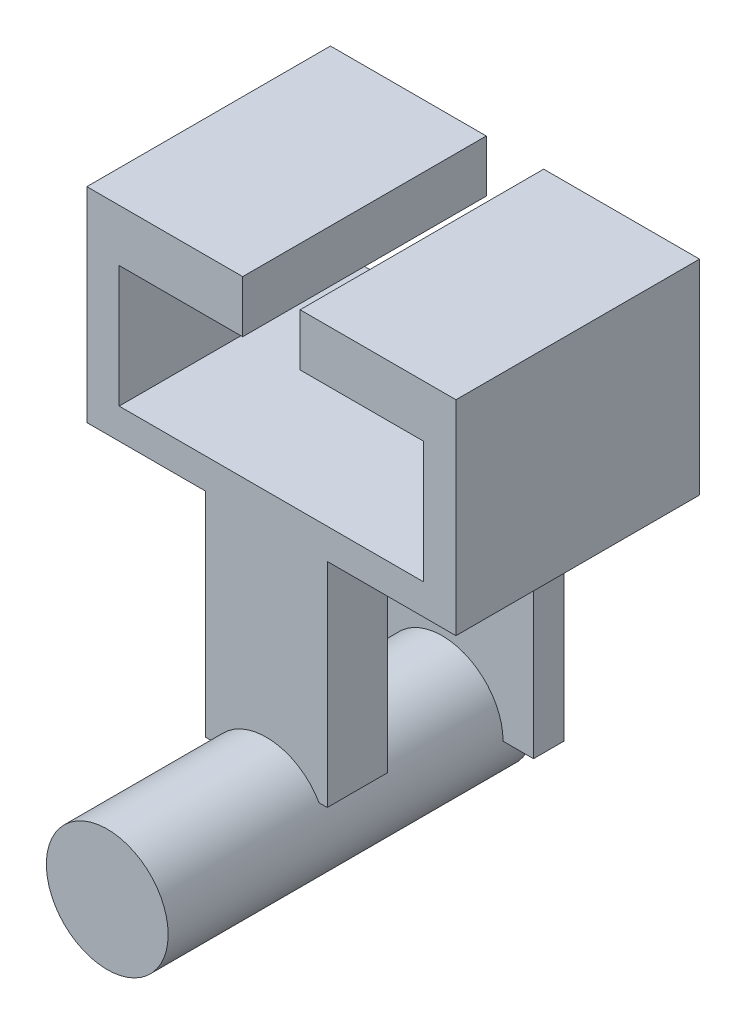
ISO-10303-21;
HEADER;
FILE_DESCRIPTION(('STEP AP214'),'2;1');
FILE_NAME('part.step','',(''),(''),'','','');
FILE_SCHEMA(('AUTOMOTIVE_DESIGN { 1 0 10303 214 1 1 1 1 }'));
ENDSEC;
DATA;
#1=APPLICATION_CONTEXT('core data for automotive mechanical design processes');
#2=APPLICATION_PROTOCOL_DEFINITION('international standard','automotive_design',2000,#1);
#3=PRODUCT_CONTEXT('',#1,'mechanical');
#4=PRODUCT('Part','Part','',(#3));
#5=PRODUCT_RELATED_PRODUCT_CATEGORY('part','',(#4));
#6=PRODUCT_DEFINITION_FORMATION('','',#4);
#7=PRODUCT_DEFINITION_CONTEXT('part definition',#1,'design');
#8=PRODUCT_DEFINITION('design','',#6,#7);
#9=PRODUCT_DEFINITION_SHAPE('','',#8);
#10=(LENGTH_UNIT() NAMED_UNIT(*) SI_UNIT(.MILLI.,.METRE.));
#11=(NAMED_UNIT(*) PLANE_ANGLE_UNIT() SI_UNIT($,.RADIAN.));
#12=(NAMED_UNIT(*) SI_UNIT($,.STERADIAN.) SOLID_ANGLE_UNIT());
#13=UNCERTAINTY_MEASURE_WITH_UNIT(LENGTH_MEASURE(1.E-05),#10,'distance_accuracy_value','');
#14=(GEOMETRIC_REPRESENTATION_CONTEXT(3) GLOBAL_UNCERTAINTY_ASSIGNED_CONTEXT((#13)) GLOBAL_UNIT_ASSIGNED_CONTEXT((#10,
#11,#12)) REPRESENTATION_CONTEXT('',''));
#15=CARTESIAN_POINT('',(0.,0.,0.));
#16=DIRECTION('',(0.,0.,1.));
#17=DIRECTION('',(1.,0.,0.));
#18=AXIS2_PLACEMENT_3D('',#15,#16,#17);
#19=CARTESIAN_POINT('',(0.,0.,76.2));
#20=DIRECTION('',(0.,0.,-1.));
#21=DIRECTION('',(-1.,0.,0.));
#22=AXIS2_PLACEMENT_3D('',#19,#20,#21);
#23=CYLINDRICAL_SURFACE('',#22,12.7);
#24=CARTESIAN_POINT('',(0.,0.,76.2));
#25=DIRECTION('',(0.,0.,1.));
#26=DIRECTION('',(1.,0.,0.));
#27=AXIS2_PLACEMENT_3D('',#24,#25,#26);
#28=CIRCLE('',#27,12.7);
#29=CARTESIAN_POINT('',(12.7,0.,76.2));
#30=VERTEX_POINT('',#29);
#31=EDGE_CURVE('E600',#30,#30,#28,.T.);
#32=ORIENTED_EDGE('',*,*,#31,.F.);
#33=EDGE_LOOP('',(#32));
#34=FACE_BOUND('',#33,.T.);
#35=DIRECTION('',(0.,0.,-1.));
#36=VECTOR('',#35,1.);
#37=CARTESIAN_POINT('',(12.7,0.,76.2));
#38=LINE('',#37,#36);
#39=CARTESIAN_POINT('',(12.7,0.,0.));
#40=VERTEX_POINT('',#39);
#41=CARTESIAN_POINT('',(12.7,0.,6.34999999999999));
#42=VERTEX_POINT('',#41);
#43=EDGE_CURVE('E618',#40,#42,#38,.F.);
#44=ORIENTED_EDGE('',*,*,#43,.T.);
#45=CARTESIAN_POINT('',(0.,0.,6.34999999999999));
#46=DIRECTION('',(0.,0.,-1.));
#47=DIRECTION('',(-1.,0.,0.));
#48=AXIS2_PLACEMENT_3D('',#45,#46,#47);
#49=CIRCLE('',#48,12.7);
#50=CARTESIAN_POINT('',(-12.7,0.,6.34999999999999));
#51=VERTEX_POINT('',#50);
#52=EDGE_CURVE('E605',#51,#42,#49,.T.);
#53=ORIENTED_EDGE('',*,*,#52,.F.);
#54=DIRECTION('',(0.,0.,-1.));
#55=VECTOR('',#54,1.);
#56=CARTESIAN_POINT('',(-12.7,0.,76.2));
#57=LINE('',#56,#55);
#58=CARTESIAN_POINT('',(-12.7,0.,0.));
#59=VERTEX_POINT('',#58);
#60=EDGE_CURVE('E620',#51,#59,#57,.T.);
#61=ORIENTED_EDGE('',*,*,#60,.T.);
#62=CARTESIAN_POINT('',(0.,0.,0.));
#63=DIRECTION('',(0.,0.,1.));
#64=DIRECTION('',(1.,0.,0.));
#65=AXIS2_PLACEMENT_3D('',#62,#63,#64);
#66=CIRCLE('',#65,12.7);
#67=EDGE_CURVE('E602',#59,#40,#66,.T.);
#68=ORIENTED_EDGE('',*,*,#67,.T.);
#69=EDGE_LOOP('',(#44,#53,#61,#68));
#70=FACE_BOUND('',#69,.T.);
#71=DIRECTION('',(0.,0.,-1.));
#72=VECTOR('',#71,1.);
#73=CARTESIAN_POINT('',(10.9985226280624,6.35000000000002,76.2));
#74=LINE('',#73,#72);
#75=CARTESIAN_POINT('',(10.9985226280624,6.35000000000002,43.0134827391879));
#76=VERTEX_POINT('',#75);
#77=CARTESIAN_POINT('',(10.9985226280624,6.35000000000002,30.4131646228967));
#78=VERTEX_POINT('',#77);
#79=EDGE_CURVE('E12',#76,#78,#74,.T.);
#80=ORIENTED_EDGE('',*,*,#79,.F.);
#81=CARTESIAN_POINT('',(0.,0.,43.0134827391879));
#82=DIRECTION('',(0.,0.,1.));
#83=DIRECTION('',(0.,-1.,0.));
#84=AXIS2_PLACEMENT_3D('',#81,#82,#83);
#85=CIRCLE('',#84,12.7);
#86=CARTESIAN_POINT('',(-10.9985226280624,6.35000000000002,43.0134827391879));
#87=VERTEX_POINT('',#86);
#88=EDGE_CURVE('E58',#76,#87,#85,.T.);
#89=ORIENTED_EDGE('',*,*,#88,.T.);
#90=DIRECTION('',(0.,0.,-1.));
#91=VECTOR('',#90,1.);
#92=CARTESIAN_POINT('',(-10.9985226280624,6.35000000000002,76.2));
#93=LINE('',#92,#91);
#94=CARTESIAN_POINT('',(-10.9985226280624,6.35000000000002,30.4131646228967));
#95=VERTEX_POINT('',#94);
#96=EDGE_CURVE('E621',#95,#87,#93,.F.);
#97=ORIENTED_EDGE('',*,*,#96,.F.);
#98=CARTESIAN_POINT('',(0.,0.,30.4131646228967));
#99=DIRECTION('',(0.,0.,1.));
#100=DIRECTION('',(0.,-1.,0.));
#101=AXIS2_PLACEMENT_3D('',#98,#99,#100);
#102=CIRCLE('',#101,12.7);
#103=EDGE_CURVE('E68',#78,#95,#102,.T.);
#104=ORIENTED_EDGE('',*,*,#103,.F.);
#105=EDGE_LOOP('',(#80,#89,#97,#104));
#106=FACE_BOUND('',#105,.T.);
#107=ADVANCED_FACE('F51',(#34,#70,#106),#23,.T.);
#108=CARTESIAN_POINT('',(32.7980582503673,82.55,-7.78651726081213));
#109=DIRECTION('',(1.,0.,0.));
#110=DIRECTION('',(0.,1.,0.));
#111=AXIS2_PLACEMENT_3D('',#108,#109,#110);
#112=PLANE('',#111);
#113=DIRECTION('',(0.,0.,1.));
#114=VECTOR('',#113,1.);
#115=CARTESIAN_POINT('',(32.7980582503673,82.55,-7.78651726081213));
#116=LINE('',#115,#114);
#117=CARTESIAN_POINT('',(32.7980582503673,82.55,-7.78651726081213));
#118=VERTEX_POINT('',#117);
#119=CARTESIAN_POINT('',(32.7980582503673,82.55,43.0134827391879));
#120=VERTEX_POINT('',#119);
#121=EDGE_CURVE('E433',#118,#120,#116,.T.);
#122=ORIENTED_EDGE('',*,*,#121,.F.);
#123=DIRECTION('',(0.,-1.,0.));
#124=VECTOR('',#123,1.);
#125=CARTESIAN_POINT('',(32.7980582503673,82.55,-7.78651726081213));
#126=LINE('',#125,#124);
#127=CARTESIAN_POINT('',(32.7980582503673,57.15,-7.78651726081213));
#128=VERTEX_POINT('',#127);
#129=EDGE_CURVE('E528',#118,#128,#126,.T.);
#130=ORIENTED_EDGE('',*,*,#129,.T.);
#131=DIRECTION('',(0.,0.,1.));
#132=VECTOR('',#131,1.);
#133=CARTESIAN_POINT('',(32.7980582503673,57.15,-7.78651726081213));
#134=LINE('',#133,#132);
#135=CARTESIAN_POINT('',(32.7980582503673,57.15,43.0134827391879));
#136=VERTEX_POINT('',#135);
#137=EDGE_CURVE('E697',#128,#136,#134,.T.);
#138=ORIENTED_EDGE('',*,*,#137,.T.);
#139=DIRECTION('',(0.,-1.,0.));
#140=VECTOR('',#139,1.);
#141=CARTESIAN_POINT('',(32.7980582503673,82.55,43.0134827391879));
#142=LINE('',#141,#140);
#143=EDGE_CURVE('E525',#120,#136,#142,.T.);
#144=ORIENTED_EDGE('',*,*,#143,.F.);
#145=EDGE_LOOP('',(#122,#130,#138,#144));
#146=FACE_BOUND('',#145,.T.);
#147=ADVANCED_FACE('F800',(#146),#112,.F.);
#148=CARTESIAN_POINT('',(-30.7019417496327,82.55,-7.78651726081213));
#149=DIRECTION('',(-1.,0.,0.));
#150=DIRECTION('',(0.,-1.,0.));
#151=AXIS2_PLACEMENT_3D('',#148,#149,#150);
#152=PLANE('',#151);
#153=DIRECTION('',(0.,0.,-1.));
#154=VECTOR('',#153,1.);
#155=CARTESIAN_POINT('',(-30.7019417496326,82.55,43.0134827391879));
#156=LINE('',#155,#154);
#157=CARTESIAN_POINT('',(-30.7019417496326,82.55,43.0134827391879));
#158=VERTEX_POINT('',#157);
#159=CARTESIAN_POINT('',(-30.7019417496327,82.55,-7.78651726081213));
#160=VERTEX_POINT('',#159);
#161=EDGE_CURVE('E475',#158,#160,#156,.T.);
#162=ORIENTED_EDGE('',*,*,#161,.F.);
#163=DIRECTION('',(0.,-1.,0.));
#164=VECTOR('',#163,1.);
#165=CARTESIAN_POINT('',(-30.7019417496326,82.55,43.0134827391879));
#166=LINE('',#165,#164);
#167=CARTESIAN_POINT('',(-30.7019417496326,57.15,43.0134827391879));
#168=VERTEX_POINT('',#167);
#169=EDGE_CURVE('E514',#158,#168,#166,.T.);
#170=ORIENTED_EDGE('',*,*,#169,.T.);
#171=DIRECTION('',(0.,0.,-1.));
#172=VECTOR('',#171,1.);
#173=CARTESIAN_POINT('',(-30.7019417496327,57.15,-7.78651726081213));
#174=LINE('',#173,#172);
#175=CARTESIAN_POINT('',(-30.7019417496327,57.15,-7.78651726081213));
#176=VERTEX_POINT('',#175);
#177=EDGE_CURVE('E503',#168,#176,#174,.T.);
#178=ORIENTED_EDGE('',*,*,#177,.T.);
#179=DIRECTION('',(0.,-1.,0.));
#180=VECTOR('',#179,1.);
#181=CARTESIAN_POINT('',(-30.7019417496327,82.55,-7.78651726081213));
#182=LINE('',#181,#180);
#183=EDGE_CURVE('E507',#160,#176,#182,.T.);
#184=ORIENTED_EDGE('',*,*,#183,.F.);
#185=EDGE_LOOP('',(#162,#170,#178,#184));
#186=FACE_BOUND('',#185,.T.);
#187=ADVANCED_FACE('F804',(#186),#152,.F.);
#188=CARTESIAN_POINT('',(0.,0.,76.2));
#189=DIRECTION('',(0.,0.,1.));
#190=DIRECTION('',(1.,0.,0.));
#191=AXIS2_PLACEMENT_3D('',#188,#189,#190);
#192=PLANE('',#191);
#193=ORIENTED_EDGE('',*,*,#31,.T.);
#194=EDGE_LOOP('',(#193));
#195=FACE_BOUND('',#194,.T.);
#196=ADVANCED_FACE('F807',(#195),#192,.T.);
#197=CARTESIAN_POINT('',(0.,0.,0.));
#198=DIRECTION('',(0.,0.,1.));
#199=DIRECTION('',(1.,0.,0.));
#200=AXIS2_PLACEMENT_3D('',#197,#198,#199);
#201=PLANE('',#200);
#202=DIRECTION('',(0.,1.,0.));
#203=VECTOR('',#202,1.);
#204=CARTESIAN_POINT('',(12.7,0.,0.));
#205=LINE('',#204,#203);
#206=CARTESIAN_POINT('',(12.7,25.4,0.));
#207=VERTEX_POINT('',#206);
#208=CARTESIAN_POINT('',(12.7,50.8,0.));
#209=VERTEX_POINT('',#208);
#210=EDGE_CURVE('E388',#207,#209,#205,.T.);
#211=ORIENTED_EDGE('',*,*,#210,.T.);
#212=DIRECTION('',(1.,0.,0.));
#213=VECTOR('',#212,1.);
#214=CARTESIAN_POINT('',(-19.05,50.8,0.));
#215=LINE('',#214,#213);
#216=CARTESIAN_POINT('',(19.05,50.8,0.));
#217=VERTEX_POINT('',#216);
#218=EDGE_CURVE('E548',#209,#217,#215,.T.);
#219=ORIENTED_EDGE('',*,*,#218,.T.);
#220=DIRECTION('',(0.,-1.,0.));
#221=VECTOR('',#220,1.);
#222=CARTESIAN_POINT('',(19.05,50.8,0.));
#223=LINE('',#222,#221);
#224=CARTESIAN_POINT('',(19.05,0.,0.));
#225=VERTEX_POINT('',#224);
#226=EDGE_CURVE('E547',#217,#225,#223,.T.);
#227=ORIENTED_EDGE('',*,*,#226,.T.);
#228=DIRECTION('',(-1.,0.,0.));
#229=VECTOR('',#228,1.);
#230=CARTESIAN_POINT('',(0.,0.,0.));
#231=LINE('',#230,#229);
#232=EDGE_CURVE('E559',#225,#40,#231,.T.);
#233=ORIENTED_EDGE('',*,*,#232,.T.);
#234=ORIENTED_EDGE('',*,*,#67,.F.);
#235=CARTESIAN_POINT('',(-19.05,0.,0.));
#236=VERTEX_POINT('',#235);
#237=EDGE_CURVE('E556',#59,#236,#231,.T.);
#238=ORIENTED_EDGE('',*,*,#237,.T.);
#239=DIRECTION('',(0.,1.,0.));
#240=VECTOR('',#239,1.);
#241=CARTESIAN_POINT('',(-19.05,0.,0.));
#242=LINE('',#241,#240);
#243=CARTESIAN_POINT('',(-19.05,50.8,0.));
#244=VERTEX_POINT('',#243);
#245=EDGE_CURVE('E715',#236,#244,#242,.T.);
#246=ORIENTED_EDGE('',*,*,#245,.T.);
#247=CARTESIAN_POINT('',(-12.7,50.8,0.));
#248=VERTEX_POINT('',#247);
#249=EDGE_CURVE('E545',#244,#248,#215,.T.);
#250=ORIENTED_EDGE('',*,*,#249,.T.);
#251=DIRECTION('',(0.,1.,0.));
#252=VECTOR('',#251,1.);
#253=CARTESIAN_POINT('',(-12.7,0.,0.));
#254=LINE('',#253,#252);
#255=CARTESIAN_POINT('',(-12.7,25.4,0.));
#256=VERTEX_POINT('',#255);
#257=EDGE_CURVE('E385',#256,#248,#254,.T.);
#258=ORIENTED_EDGE('',*,*,#257,.F.);
#259=DIRECTION('',(1.,0.,0.));
#260=VECTOR('',#259,1.);
#261=CARTESIAN_POINT('',(0.,25.4,0.));
#262=LINE('',#261,#260);
#263=EDGE_CURVE('E394',#256,#207,#262,.T.);
#264=ORIENTED_EDGE('',*,*,#263,.T.);
#265=EDGE_LOOP('',(#211,#219,#227,#233,#234,#238,#246,#250,#258,#264));
#266=FACE_BOUND('',#265,.T.);
#267=ADVANCED_FACE('F739',(#266),#201,.F.);
#268=CARTESIAN_POINT('',(0.,0.,6.35));
#269=DIRECTION('',(0.,-1.,0.));
#270=DIRECTION('',(0.,0.,-1.));
#271=AXIS2_PLACEMENT_3D('',#268,#269,#270);
#272=PLANE('',#271);
#273=ORIENTED_EDGE('',*,*,#60,.F.);
#274=DIRECTION('',(-1.,0.,0.));
#275=VECTOR('',#274,1.);
#276=CARTESIAN_POINT('',(19.05,0.,6.35));
#277=LINE('',#276,#275);
#278=CARTESIAN_POINT('',(-19.05,0.,6.35));
#279=VERTEX_POINT('',#278);
#280=EDGE_CURVE('E576',#51,#279,#277,.T.);
#281=ORIENTED_EDGE('',*,*,#280,.T.);
#282=DIRECTION('',(0.,0.,-1.));
#283=VECTOR('',#282,1.);
#284=CARTESIAN_POINT('',(-19.05,0.,6.35));
#285=LINE('',#284,#283);
#286=EDGE_CURVE('E722',#279,#236,#285,.T.);
#287=ORIENTED_EDGE('',*,*,#286,.T.);
#288=ORIENTED_EDGE('',*,*,#237,.F.);
#289=EDGE_LOOP('',(#273,#281,#287,#288));
#290=FACE_BOUND('',#289,.T.);
#291=ADVANCED_FACE('F815',(#290),#272,.T.);
#292=ORIENTED_EDGE('',*,*,#43,.F.);
#293=ORIENTED_EDGE('',*,*,#232,.F.);
#294=DIRECTION('',(0.,0.,-1.));
#295=VECTOR('',#294,1.);
#296=CARTESIAN_POINT('',(19.05,0.,6.35));
#297=LINE('',#296,#295);
#298=CARTESIAN_POINT('',(19.05,0.,6.35));
#299=VERTEX_POINT('',#298);
#300=EDGE_CURVE('E593',#299,#225,#297,.T.);
#301=ORIENTED_EDGE('',*,*,#300,.F.);
#302=EDGE_CURVE('E578',#299,#42,#277,.T.);
#303=ORIENTED_EDGE('',*,*,#302,.T.);
#304=EDGE_LOOP('',(#292,#293,#301,#303));
#305=FACE_BOUND('',#304,.T.);
#306=ADVANCED_FACE('F737',(#305),#272,.T.);
#307=CARTESIAN_POINT('',(-19.05,0.,6.35));
#308=DIRECTION('',(-1.,0.,0.));
#309=DIRECTION('',(0.,0.,1.));
#310=AXIS2_PLACEMENT_3D('',#307,#308,#309);
#311=PLANE('',#310);
#312=ORIENTED_EDGE('',*,*,#245,.F.);
#313=ORIENTED_EDGE('',*,*,#286,.F.);
#314=DIRECTION('',(0.,1.,0.));
#315=VECTOR('',#314,1.);
#316=CARTESIAN_POINT('',(-19.05,0.,6.35));
#317=LINE('',#316,#315);
#318=CARTESIAN_POINT('',(-19.05,50.8,6.35));
#319=VERTEX_POINT('',#318);
#320=EDGE_CURVE('E549',#279,#319,#317,.T.);
#321=ORIENTED_EDGE('',*,*,#320,.T.);
#322=DIRECTION('',(0.,0.,-1.));
#323=VECTOR('',#322,1.);
#324=CARTESIAN_POINT('',(-19.05,50.8,6.35));
#325=LINE('',#324,#323);
#326=EDGE_CURVE('E727',#319,#244,#325,.T.);
#327=ORIENTED_EDGE('',*,*,#326,.T.);
#328=EDGE_LOOP('',(#312,#313,#321,#327));
#329=FACE_BOUND('',#328,.T.);
#330=ADVANCED_FACE('F776',(#329),#311,.T.);
#331=CARTESIAN_POINT('',(19.05,50.8,6.35));
#332=DIRECTION('',(1.,0.,0.));
#333=DIRECTION('',(0.,1.,0.));
#334=AXIS2_PLACEMENT_3D('',#331,#332,#333);
#335=PLANE('',#334);
#336=ORIENTED_EDGE('',*,*,#226,.F.);
#337=DIRECTION('',(0.,0.,-1.));
#338=VECTOR('',#337,1.);
#339=CARTESIAN_POINT('',(19.05,50.8,6.35));
#340=LINE('',#339,#338);
#341=CARTESIAN_POINT('',(19.05,50.8,6.35));
#342=VERTEX_POINT('',#341);
#343=EDGE_CURVE('E588',#342,#217,#340,.T.);
#344=ORIENTED_EDGE('',*,*,#343,.F.);
#345=DIRECTION('',(0.,-1.,0.));
#346=VECTOR('',#345,1.);
#347=CARTESIAN_POINT('',(19.05,50.8,6.35));
#348=LINE('',#347,#346);
#349=EDGE_CURVE('E575',#342,#299,#348,.T.);
#350=ORIENTED_EDGE('',*,*,#349,.T.);
#351=ORIENTED_EDGE('',*,*,#300,.T.);
#352=EDGE_LOOP('',(#336,#344,#350,#351));
#353=FACE_BOUND('',#352,.T.);
#354=ADVANCED_FACE('F742',(#353),#335,.T.);
#355=CARTESIAN_POINT('',(0.,0.,6.35));
#356=DIRECTION('',(0.,0.,-1.));
#357=DIRECTION('',(-1.,0.,0.));
#358=AXIS2_PLACEMENT_3D('',#355,#356,#357);
#359=PLANE('',#358);
#360=ORIENTED_EDGE('',*,*,#52,.T.);
#361=ORIENTED_EDGE('',*,*,#302,.F.);
#362=ORIENTED_EDGE('',*,*,#349,.F.);
#363=DIRECTION('',(1.,0.,0.));
#364=VECTOR('',#363,1.);
#365=CARTESIAN_POINT('',(-19.05,50.8,6.35));
#366=LINE('',#365,#364);
#367=CARTESIAN_POINT('',(12.7,50.8,6.35));
#368=VERTEX_POINT('',#367);
#369=EDGE_CURVE('E572',#368,#342,#366,.T.);
#370=ORIENTED_EDGE('',*,*,#369,.F.);
#371=DIRECTION('',(0.,-1.,0.));
#372=VECTOR('',#371,1.);
#373=CARTESIAN_POINT('',(12.7,0.,6.35));
#374=LINE('',#373,#372);
#375=CARTESIAN_POINT('',(12.7,25.4,6.35));
#376=VERTEX_POINT('',#375);
#377=EDGE_CURVE('E416',#368,#376,#374,.T.);
#378=ORIENTED_EDGE('',*,*,#377,.T.);
#379=DIRECTION('',(1.,0.,0.));
#380=VECTOR('',#379,1.);
#381=CARTESIAN_POINT('',(0.,25.4,6.35));
#382=LINE('',#381,#380);
#383=CARTESIAN_POINT('',(-12.7,25.4,6.35));
#384=VERTEX_POINT('',#383);
#385=EDGE_CURVE('E408',#376,#384,#382,.F.);
#386=ORIENTED_EDGE('',*,*,#385,.T.);
#387=DIRECTION('',(0.,-1.,0.));
#388=VECTOR('',#387,1.);
#389=CARTESIAN_POINT('',(-12.7,0.,6.35));
#390=LINE('',#389,#388);
#391=CARTESIAN_POINT('',(-12.7,50.8,6.35));
#392=VERTEX_POINT('',#391);
#393=EDGE_CURVE('E426',#392,#384,#390,.T.);
#394=ORIENTED_EDGE('',*,*,#393,.F.);
#395=EDGE_CURVE('E568',#319,#392,#366,.T.);
#396=ORIENTED_EDGE('',*,*,#395,.F.);
#397=ORIENTED_EDGE('',*,*,#320,.F.);
#398=ORIENTED_EDGE('',*,*,#280,.F.);
#399=EDGE_LOOP('',(#360,#361,#362,#370,#378,#386,#394,#396,#397,#398));
#400=FACE_BOUND('',#399,.T.);
#401=ADVANCED_FACE('F749',(#400),#359,.F.);
#402=CARTESIAN_POINT('',(-30.7019417496327,57.15,43.0134827391879));
#403=DIRECTION('',(0.,0.,-1.));
#404=DIRECTION('',(-1.,0.,0.));
#405=AXIS2_PLACEMENT_3D('',#402,#403,#404);
#406=PLANE('',#405);
#407=DIRECTION('',(1.,0.,0.));
#408=VECTOR('',#407,1.);
#409=CARTESIAN_POINT('',(-30.7019417496327,50.8,43.0134827391879));
#410=LINE('',#409,#408);
#411=CARTESIAN_POINT('',(12.7,50.8,43.0134827391879));
#412=VERTEX_POINT('',#411);
#413=CARTESIAN_POINT('',(39.5366782503673,50.8,43.0134827391879));
#414=VERTEX_POINT('',#413);
#415=EDGE_CURVE('E527',#412,#414,#410,.T.);
#416=ORIENTED_EDGE('',*,*,#415,.T.);
#417=DIRECTION('',(0.,-1.,0.));
#418=VECTOR('',#417,1.);
#419=CARTESIAN_POINT('',(39.5366782503673,93.4212,43.0134827391879));
#420=LINE('',#419,#418);
#421=CARTESIAN_POINT('',(39.5366782503673,93.4212,43.0134827391879));
#422=VERTEX_POINT('',#421);
#423=EDGE_CURVE('E288',#422,#414,#420,.T.);
#424=ORIENTED_EDGE('',*,*,#423,.F.);
#425=DIRECTION('',(1.,0.,0.));
#426=VECTOR('',#425,1.);
#427=CARTESIAN_POINT('',(32.7980582503673,93.4212,43.0134827391879));
#428=LINE('',#427,#426);
#429=CARTESIAN_POINT('',(7.03483825036735,93.4212,43.0134827391879));
#430=VERTEX_POINT('',#429);
#431=EDGE_CURVE('E465',#430,#422,#428,.T.);
#432=ORIENTED_EDGE('',*,*,#431,.F.);
#433=DIRECTION('',(0.,1.,0.));
#434=VECTOR('',#433,1.);
#435=CARTESIAN_POINT('',(7.03483825036735,93.4212,43.0134827391879));
#436=LINE('',#435,#434);
#437=CARTESIAN_POINT('',(7.03483825036735,82.55,43.0134827391879));
#438=VERTEX_POINT('',#437);
#439=EDGE_CURVE('E445',#438,#430,#436,.T.);
#440=ORIENTED_EDGE('',*,*,#439,.F.);
#441=DIRECTION('',(1.,0.,0.));
#442=VECTOR('',#441,1.);
#443=CARTESIAN_POINT('',(7.03483825036735,82.55,43.0134827391879));
#444=LINE('',#443,#442);
#445=EDGE_CURVE('E452',#438,#120,#444,.T.);
#446=ORIENTED_EDGE('',*,*,#445,.T.);
#447=ORIENTED_EDGE('',*,*,#143,.T.);
#448=DIRECTION('',(1.,0.,0.));
#449=VECTOR('',#448,1.);
#450=CARTESIAN_POINT('',(-30.7019417496327,57.15,43.0134827391879));
#451=LINE('',#450,#449);
#452=EDGE_CURVE('E529',#168,#136,#451,.T.);
#453=ORIENTED_EDGE('',*,*,#452,.F.);
#454=ORIENTED_EDGE('',*,*,#169,.F.);
#455=DIRECTION('',(-1.,0.,0.));
#456=VECTOR('',#455,1.);
#457=CARTESIAN_POINT('',(-4.93872174963264,82.55,43.0134827391879));
#458=LINE('',#457,#456);
#459=CARTESIAN_POINT('',(-4.93872174963264,82.55,43.0134827391879));
#460=VERTEX_POINT('',#459);
#461=EDGE_CURVE('E488',#460,#158,#458,.T.);
#462=ORIENTED_EDGE('',*,*,#461,.F.);
#463=DIRECTION('',(0.,-1.,0.));
#464=VECTOR('',#463,1.);
#465=CARTESIAN_POINT('',(-4.93872174963264,93.4212,43.0134827391879));
#466=LINE('',#465,#464);
#467=CARTESIAN_POINT('',(-4.93872174963264,93.4212,43.0134827391879));
#468=VERTEX_POINT('',#467);
#469=EDGE_CURVE('E479',#468,#460,#466,.T.);
#470=ORIENTED_EDGE('',*,*,#469,.F.);
#471=DIRECTION('',(1.,0.,0.));
#472=VECTOR('',#471,1.);
#473=CARTESIAN_POINT('',(-31.0905617496326,93.4212,43.0134827391879));
#474=LINE('',#473,#472);
#475=CARTESIAN_POINT('',(-37.4405617496326,93.4212,43.0134827391879));
#476=VERTEX_POINT('',#475);
#477=EDGE_CURVE('E500',#476,#468,#474,.T.);
#478=ORIENTED_EDGE('',*,*,#477,.F.);
#479=DIRECTION('',(0.,1.,0.));
#480=VECTOR('',#479,1.);
#481=CARTESIAN_POINT('',(-37.4405617496326,93.4212,43.0134827391879));
#482=LINE('',#481,#480);
#483=CARTESIAN_POINT('',(-37.4405617496326,50.8,43.0134827391879));
#484=VERTEX_POINT('',#483);
#485=EDGE_CURVE('E270',#484,#476,#482,.T.);
#486=ORIENTED_EDGE('',*,*,#485,.F.);
#487=CARTESIAN_POINT('',(-12.7,50.8,43.0134827391879));
#488=VERTEX_POINT('',#487);
#489=EDGE_CURVE('E256',#484,#488,#410,.T.);
#490=ORIENTED_EDGE('',*,*,#489,.T.);
#491=DIRECTION('',(0.,1.,0.));
#492=VECTOR('',#491,1.);
#493=CARTESIAN_POINT('',(-12.7,6.35000000000002,43.0134827391879));
#494=LINE('',#493,#492);
#495=CARTESIAN_POINT('',(-12.7,6.35000000000002,43.0134827391879));
#496=VERTEX_POINT('',#495);
#497=EDGE_CURVE('E328',#496,#488,#494,.T.);
#498=ORIENTED_EDGE('',*,*,#497,.F.);
#499=DIRECTION('',(1.,0.,0.));
#500=VECTOR('',#499,1.);
#501=CARTESIAN_POINT('',(-12.7,6.35000000000002,43.0134827391879));
#502=LINE('',#501,#500);
#503=EDGE_CURVE('E337',#496,#87,#502,.T.);
#504=ORIENTED_EDGE('',*,*,#503,.T.);
#505=ORIENTED_EDGE('',*,*,#88,.F.);
#506=CARTESIAN_POINT('',(12.7,6.35000000000002,43.0134827391879));
#507=VERTEX_POINT('',#506);
#508=EDGE_CURVE('E326',#76,#507,#502,.T.);
#509=ORIENTED_EDGE('',*,*,#508,.T.);
#510=DIRECTION('',(0.,1.,0.));
#511=VECTOR('',#510,1.);
#512=CARTESIAN_POINT('',(12.7,6.35000000000002,43.0134827391879));
#513=LINE('',#512,#511);
#514=EDGE_CURVE('E357',#507,#412,#513,.T.);
#515=ORIENTED_EDGE('',*,*,#514,.T.);
#516=EDGE_LOOP('',(#416,#424,#432,#440,#446,#447,#453,#454,#462,#470,#478,#486,#490,#498,#504,
#505,#509,#515));
#517=FACE_BOUND('',#516,.T.);
#518=ADVANCED_FACE('F634',(#517),#406,.F.);
#519=CARTESIAN_POINT('',(-30.7019417496327,57.15,-7.78651726081213));
#520=DIRECTION('',(0.,0.,1.));
#521=DIRECTION('',(1.,0.,0.));
#522=AXIS2_PLACEMENT_3D('',#519,#520,#521);
#523=PLANE('',#522);
#524=DIRECTION('',(-1.,0.,0.));
#525=VECTOR('',#524,1.);
#526=CARTESIAN_POINT('',(-4.93872174963265,82.55,-7.78651726081213));
#527=LINE('',#526,#525);
#528=CARTESIAN_POINT('',(-4.93872174963265,82.55,-7.78651726081213));
#529=VERTEX_POINT('',#528);
#530=EDGE_CURVE('E485',#529,#160,#527,.T.);
#531=ORIENTED_EDGE('',*,*,#530,.T.);
#532=ORIENTED_EDGE('',*,*,#183,.T.);
#533=DIRECTION('',(-1.,0.,0.));
#534=VECTOR('',#533,1.);
#535=CARTESIAN_POINT('',(-30.7019417496327,57.15,-7.78651726081213));
#536=LINE('',#535,#534);
#537=EDGE_CURVE('E534',#128,#176,#536,.T.);
#538=ORIENTED_EDGE('',*,*,#537,.F.);
#539=ORIENTED_EDGE('',*,*,#129,.F.);
#540=DIRECTION('',(1.,0.,0.));
#541=VECTOR('',#540,1.);
#542=CARTESIAN_POINT('',(7.03483825036735,82.55,-7.78651726081213));
#543=LINE('',#542,#541);
#544=CARTESIAN_POINT('',(7.03483825036735,82.55,-7.78651726081213));
#545=VERTEX_POINT('',#544);
#546=EDGE_CURVE('E457',#545,#118,#543,.T.);
#547=ORIENTED_EDGE('',*,*,#546,.F.);
#548=DIRECTION('',(0.,-1.,0.));
#549=VECTOR('',#548,1.);
#550=CARTESIAN_POINT('',(7.03483825036735,93.4212,-7.78651726081213));
#551=LINE('',#550,#549);
#552=CARTESIAN_POINT('',(7.03483825036735,93.4212,-7.78651726081213));
#553=VERTEX_POINT('',#552);
#554=EDGE_CURVE('E432',#553,#545,#551,.T.);
#555=ORIENTED_EDGE('',*,*,#554,.F.);
#556=DIRECTION('',(-1.,0.,0.));
#557=VECTOR('',#556,1.);
#558=CARTESIAN_POINT('',(32.7980582503673,93.4212,-7.78651726081213));
#559=LINE('',#558,#557);
#560=CARTESIAN_POINT('',(39.5366782503673,93.4212,-7.78651726081213));
#561=VERTEX_POINT('',#560);
#562=EDGE_CURVE('E467',#561,#553,#559,.T.);
#563=ORIENTED_EDGE('',*,*,#562,.F.);
#564=DIRECTION('',(0.,1.,0.));
#565=VECTOR('',#564,1.);
#566=CARTESIAN_POINT('',(39.5366782503673,93.4212,-7.78651726081213));
#567=LINE('',#566,#565);
#568=CARTESIAN_POINT('',(39.5366782503673,50.8,-7.78651726081213));
#569=VERTEX_POINT('',#568);
#570=EDGE_CURVE('E296',#569,#561,#567,.T.);
#571=ORIENTED_EDGE('',*,*,#570,.F.);
#572=DIRECTION('',(-1.,0.,0.));
#573=VECTOR('',#572,1.);
#574=CARTESIAN_POINT('',(-30.7019417496327,50.8,-7.78651726081213));
#575=LINE('',#574,#573);
#576=CARTESIAN_POINT('',(12.7,50.8,-7.78651726081213));
#577=VERTEX_POINT('',#576);
#578=EDGE_CURVE('E257',#569,#577,#575,.T.);
#579=ORIENTED_EDGE('',*,*,#578,.T.);
#580=CARTESIAN_POINT('',(-12.7,50.8,-7.78651726081213));
#581=VERTEX_POINT('',#580);
#582=EDGE_CURVE('E255',#577,#581,#575,.T.);
#583=ORIENTED_EDGE('',*,*,#582,.T.);
#584=CARTESIAN_POINT('',(-37.4405617496327,50.8,-7.78651726081213));
#585=VERTEX_POINT('',#584);
#586=EDGE_CURVE('E244',#581,#585,#575,.T.);
#587=ORIENTED_EDGE('',*,*,#586,.T.);
#588=DIRECTION('',(0.,-1.,0.));
#589=VECTOR('',#588,1.);
#590=CARTESIAN_POINT('',(-37.4405617496327,93.4212,-7.78651726081213));
#591=LINE('',#590,#589);
#592=CARTESIAN_POINT('',(-37.4405617496327,93.4212,-7.78651726081213));
#593=VERTEX_POINT('',#592);
#594=EDGE_CURVE('E248',#593,#585,#591,.T.);
#595=ORIENTED_EDGE('',*,*,#594,.F.);
#596=DIRECTION('',(-1.,0.,0.));
#597=VECTOR('',#596,1.);
#598=CARTESIAN_POINT('',(-31.0905617496326,93.4212,-7.78651726081213));
#599=LINE('',#598,#597);
#600=CARTESIAN_POINT('',(-4.93872174963265,93.4212,-7.78651726081213));
#601=VERTEX_POINT('',#600);
#602=EDGE_CURVE('E501',#601,#593,#599,.T.);
#603=ORIENTED_EDGE('',*,*,#602,.F.);
#604=DIRECTION('',(0.,1.,0.));
#605=VECTOR('',#604,1.);
#606=CARTESIAN_POINT('',(-4.93872174963265,93.4212,-7.78651726081213));
#607=LINE('',#606,#605);
#608=EDGE_CURVE('E674',#529,#601,#607,.T.);
#609=ORIENTED_EDGE('',*,*,#608,.F.);
#610=EDGE_LOOP('',(#531,#532,#538,#539,#547,#555,#563,#571,#579,#583,#587,#595,#603,#609));
#611=FACE_BOUND('',#610,.T.);
#612=ADVANCED_FACE('F250',(#611),#523,.F.);
#613=CARTESIAN_POINT('',(0.,57.15,0.));
#614=DIRECTION('',(0.,1.,0.));
#615=DIRECTION('',(-1.,0.,0.));
#616=AXIS2_PLACEMENT_3D('',#613,#614,#615);
#617=PLANE('',#616);
#618=ORIENTED_EDGE('',*,*,#537,.T.);
#619=ORIENTED_EDGE('',*,*,#177,.F.);
#620=ORIENTED_EDGE('',*,*,#452,.T.);
#621=ORIENTED_EDGE('',*,*,#137,.F.);
#622=EDGE_LOOP('',(#618,#619,#620,#621));
#623=FACE_BOUND('',#622,.T.);
#624=ADVANCED_FACE('F835',(#623),#617,.T.);
#625=CARTESIAN_POINT('',(0.,50.8,0.));
#626=DIRECTION('',(0.,1.,0.));
#627=DIRECTION('',(-1.,0.,0.));
#628=AXIS2_PLACEMENT_3D('',#625,#626,#627);
#629=PLANE('',#628);
#630=ORIENTED_EDGE('',*,*,#415,.F.);
#631=DIRECTION('',(0.,0.,-1.));
#632=VECTOR('',#631,1.);
#633=CARTESIAN_POINT('',(12.7,50.8,43.0134827391879));
#634=LINE('',#633,#632);
#635=CARTESIAN_POINT('',(12.7,50.8,30.4131646228967));
#636=VERTEX_POINT('',#635);
#637=EDGE_CURVE('E315',#412,#636,#634,.T.);
#638=ORIENTED_EDGE('',*,*,#637,.T.);
#639=DIRECTION('',(1.,0.,0.));
#640=VECTOR('',#639,1.);
#641=CARTESIAN_POINT('',(-12.7,50.8,30.4131646228967));
#642=LINE('',#641,#640);
#643=CARTESIAN_POINT('',(-12.7,50.8,30.4131646228967));
#644=VERTEX_POINT('',#643);
#645=EDGE_CURVE('E317',#644,#636,#642,.T.);
#646=ORIENTED_EDGE('',*,*,#645,.F.);
#647=DIRECTION('',(0.,0.,-1.));
#648=VECTOR('',#647,1.);
#649=CARTESIAN_POINT('',(-12.7,50.8,43.0134827391879));
#650=LINE('',#649,#648);
#651=EDGE_CURVE('E323',#488,#644,#650,.T.);
#652=ORIENTED_EDGE('',*,*,#651,.F.);
#653=ORIENTED_EDGE('',*,*,#489,.F.);
#654=DIRECTION('',(0.,0.,1.));
#655=VECTOR('',#654,1.);
#656=CARTESIAN_POINT('',(-37.4405617496327,50.8,-7.78651726081213));
#657=LINE('',#656,#655);
#658=EDGE_CURVE('E259',#585,#484,#657,.T.);
#659=ORIENTED_EDGE('',*,*,#658,.F.);
#660=ORIENTED_EDGE('',*,*,#586,.F.);
#661=DIRECTION('',(0.,0.,-1.));
#662=VECTOR('',#661,1.);
#663=CARTESIAN_POINT('',(-12.7,50.8,0.));
#664=LINE('',#663,#662);
#665=EDGE_CURVE('E377',#248,#581,#664,.T.);
#666=ORIENTED_EDGE('',*,*,#665,.F.);
#667=ORIENTED_EDGE('',*,*,#249,.F.);
#668=ORIENTED_EDGE('',*,*,#326,.F.);
#669=ORIENTED_EDGE('',*,*,#395,.T.);
#670=DIRECTION('',(0.,0.,-1.));
#671=VECTOR('',#670,1.);
#672=CARTESIAN_POINT('',(-12.7,50.8,0.));
#673=LINE('',#672,#671);
#674=CARTESIAN_POINT('',(-12.7,50.8,17.6134827391879));
#675=VERTEX_POINT('',#674);
#676=EDGE_CURVE('E425',#675,#392,#673,.T.);
#677=ORIENTED_EDGE('',*,*,#676,.F.);
#678=DIRECTION('',(-1.,0.,0.));
#679=VECTOR('',#678,1.);
#680=CARTESIAN_POINT('',(0.,50.8,17.6134827391879));
#681=LINE('',#680,#679);
#682=CARTESIAN_POINT('',(12.7,50.8,17.6134827391879));
#683=VERTEX_POINT('',#682);
#684=EDGE_CURVE('E406',#675,#683,#681,.F.);
#685=ORIENTED_EDGE('',*,*,#684,.T.);
#686=DIRECTION('',(0.,0.,-1.));
#687=VECTOR('',#686,1.);
#688=CARTESIAN_POINT('',(12.7,50.8,0.));
#689=LINE('',#688,#687);
#690=EDGE_CURVE('E415',#683,#368,#689,.T.);
#691=ORIENTED_EDGE('',*,*,#690,.T.);
#692=ORIENTED_EDGE('',*,*,#369,.T.);
#693=ORIENTED_EDGE('',*,*,#343,.T.);
#694=ORIENTED_EDGE('',*,*,#218,.F.);
#695=DIRECTION('',(0.,0.,-1.));
#696=VECTOR('',#695,1.);
#697=CARTESIAN_POINT('',(12.7,50.8,0.));
#698=LINE('',#697,#696);
#699=EDGE_CURVE('E383',#209,#577,#698,.T.);
#700=ORIENTED_EDGE('',*,*,#699,.T.);
#701=ORIENTED_EDGE('',*,*,#578,.F.);
#702=DIRECTION('',(0.,0.,-1.));
#703=VECTOR('',#702,1.);
#704=CARTESIAN_POINT('',(39.5366782503673,50.8,43.0134827391879));
#705=LINE('',#704,#703);
#706=EDGE_CURVE('E291',#414,#569,#705,.T.);
#707=ORIENTED_EDGE('',*,*,#706,.F.);
#708=EDGE_LOOP('',(#630,#638,#646,#652,#653,#659,#660,#666,#667,#668,#669,#677,#685,#691,#692,
#693,#694,#700,#701,#707));
#709=FACE_BOUND('',#708,.T.);
#710=ADVANCED_FACE('F262',(#709),#629,.F.);
#711=CARTESIAN_POINT('',(0.,93.4212,0.));
#712=DIRECTION('',(0.,1.,0.));
#713=DIRECTION('',(0.,0.,1.));
#714=AXIS2_PLACEMENT_3D('',#711,#712,#713);
#715=PLANE('',#714);
#716=ORIENTED_EDGE('',*,*,#602,.T.);
#717=DIRECTION('',(0.,0.,-1.));
#718=VECTOR('',#717,1.);
#719=CARTESIAN_POINT('',(-37.4405617496327,93.4212,-7.78651726081213));
#720=LINE('',#719,#718);
#721=EDGE_CURVE('E275',#476,#593,#720,.T.);
#722=ORIENTED_EDGE('',*,*,#721,.F.);
#723=ORIENTED_EDGE('',*,*,#477,.T.);
#724=DIRECTION('',(0.,0.,1.));
#725=VECTOR('',#724,1.);
#726=CARTESIAN_POINT('',(-4.93872174963264,93.4212,43.0134827391879));
#727=LINE('',#726,#725);
#728=EDGE_CURVE('E476',#601,#468,#727,.T.);
#729=ORIENTED_EDGE('',*,*,#728,.F.);
#730=EDGE_LOOP('',(#716,#722,#723,#729));
#731=FACE_BOUND('',#730,.T.);
#732=ADVANCED_FACE('F667',(#731),#715,.T.);
#733=CARTESIAN_POINT('',(-4.93872174963264,82.55,43.0134827391879));
#734=DIRECTION('',(0.,1.,0.));
#735=DIRECTION('',(-1.,0.,0.));
#736=AXIS2_PLACEMENT_3D('',#733,#734,#735);
#737=PLANE('',#736);
#738=ORIENTED_EDGE('',*,*,#461,.T.);
#739=ORIENTED_EDGE('',*,*,#161,.T.);
#740=ORIENTED_EDGE('',*,*,#530,.F.);
#741=DIRECTION('',(0.,0.,-1.));
#742=VECTOR('',#741,1.);
#743=CARTESIAN_POINT('',(-4.93872174963264,82.55,43.0134827391879));
#744=LINE('',#743,#742);
#745=EDGE_CURVE('E677',#460,#529,#744,.T.);
#746=ORIENTED_EDGE('',*,*,#745,.F.);
#747=EDGE_LOOP('',(#738,#739,#740,#746));
#748=FACE_BOUND('',#747,.T.);
#749=ADVANCED_FACE('F838',(#748),#737,.F.);
#750=CARTESIAN_POINT('',(-4.93872174963268,0.,0.));
#751=DIRECTION('',(1.,0.,0.));
#752=DIRECTION('',(0.,1.,0.));
#753=AXIS2_PLACEMENT_3D('',#750,#751,#752);
#754=PLANE('',#753);
#755=ORIENTED_EDGE('',*,*,#745,.T.);
#756=ORIENTED_EDGE('',*,*,#608,.T.);
#757=ORIENTED_EDGE('',*,*,#728,.T.);
#758=ORIENTED_EDGE('',*,*,#469,.T.);
#759=EDGE_LOOP('',(#755,#756,#757,#758));
#760=FACE_BOUND('',#759,.T.);
#761=ADVANCED_FACE('F673',(#760),#754,.T.);
#762=CARTESIAN_POINT('',(0.,93.4212,0.));
#763=DIRECTION('',(0.,1.,0.));
#764=DIRECTION('',(0.,0.,1.));
#765=AXIS2_PLACEMENT_3D('',#762,#763,#764);
#766=PLANE('',#765);
#767=ORIENTED_EDGE('',*,*,#562,.T.);
#768=DIRECTION('',(0.,0.,-1.));
#769=VECTOR('',#768,1.);
#770=CARTESIAN_POINT('',(7.03483825036735,93.4212,-7.78651726081213));
#771=LINE('',#770,#769);
#772=EDGE_CURVE('E460',#430,#553,#771,.T.);
#773=ORIENTED_EDGE('',*,*,#772,.F.);
#774=ORIENTED_EDGE('',*,*,#431,.T.);
#775=DIRECTION('',(0.,0.,1.));
#776=VECTOR('',#775,1.);
#777=CARTESIAN_POINT('',(39.5366782503673,93.4212,43.0134827391879));
#778=LINE('',#777,#776);
#779=EDGE_CURVE('E303',#561,#422,#778,.T.);
#780=ORIENTED_EDGE('',*,*,#779,.F.);
#781=EDGE_LOOP('',(#767,#773,#774,#780));
#782=FACE_BOUND('',#781,.T.);
#783=ADVANCED_FACE('F844',(#782),#766,.T.);
#784=CARTESIAN_POINT('',(7.03483825036735,82.55,-7.78651726081213));
#785=DIRECTION('',(0.,1.,0.));
#786=DIRECTION('',(-1.,0.,0.));
#787=AXIS2_PLACEMENT_3D('',#784,#785,#786);
#788=PLANE('',#787);
#789=ORIENTED_EDGE('',*,*,#121,.T.);
#790=ORIENTED_EDGE('',*,*,#445,.F.);
#791=DIRECTION('',(0.,0.,1.));
#792=VECTOR('',#791,1.);
#793=CARTESIAN_POINT('',(7.03483825036735,82.55,-7.78651726081213));
#794=LINE('',#793,#792);
#795=EDGE_CURVE('E438',#545,#438,#794,.T.);
#796=ORIENTED_EDGE('',*,*,#795,.F.);
#797=ORIENTED_EDGE('',*,*,#546,.T.);
#798=EDGE_LOOP('',(#789,#790,#796,#797));
#799=FACE_BOUND('',#798,.T.);
#800=ADVANCED_FACE('F849',(#799),#788,.F.);
#801=CARTESIAN_POINT('',(7.03483825036735,0.,0.));
#802=DIRECTION('',(-1.,0.,0.));
#803=DIRECTION('',(0.,0.,1.));
#804=AXIS2_PLACEMENT_3D('',#801,#802,#803);
#805=PLANE('',#804);
#806=ORIENTED_EDGE('',*,*,#772,.T.);
#807=ORIENTED_EDGE('',*,*,#554,.T.);
#808=ORIENTED_EDGE('',*,*,#795,.T.);
#809=ORIENTED_EDGE('',*,*,#439,.T.);
#810=EDGE_LOOP('',(#806,#807,#808,#809));
#811=FACE_BOUND('',#810,.T.);
#812=ADVANCED_FACE('F851',(#811),#805,.T.);
#813=CARTESIAN_POINT('',(-12.7,40.3606,34.2067413695939));
#814=DIRECTION('',(1.,0.,0.));
#815=DIRECTION('',(0.,0.,-1.));
#816=AXIS2_PLACEMENT_3D('',#813,#814,#815);
#817=PLANE('',#816);
#818=ORIENTED_EDGE('',*,*,#676,.T.);
#819=ORIENTED_EDGE('',*,*,#393,.T.);
#820=DIRECTION('',(0.,0.914150584148284,0.40537477659735));
#821=VECTOR('',#820,1.);
#822=CARTESIAN_POINT('',(-12.7,25.4,6.35));
#823=LINE('',#822,#821);
#824=EDGE_CURVE('E398',#384,#675,#823,.T.);
#825=ORIENTED_EDGE('',*,*,#824,.T.);
#826=EDGE_LOOP('',(#818,#819,#825));
#827=FACE_BOUND('',#826,.T.);
#828=ADVANCED_FACE('F785',(#827),#817,.F.);
#829=CARTESIAN_POINT('',(12.7,40.3606,34.2067413695939));
#830=DIRECTION('',(1.,0.,0.));
#831=DIRECTION('',(0.,0.,-1.));
#832=AXIS2_PLACEMENT_3D('',#829,#830,#831);
#833=PLANE('',#832);
#834=ORIENTED_EDGE('',*,*,#377,.F.);
#835=ORIENTED_EDGE('',*,*,#690,.F.);
#836=DIRECTION('',(0.,0.914150584148284,0.40537477659735));
#837=VECTOR('',#836,1.);
#838=CARTESIAN_POINT('',(12.7,25.4,6.35));
#839=LINE('',#838,#837);
#840=EDGE_CURVE('E404',#376,#683,#839,.T.);
#841=ORIENTED_EDGE('',*,*,#840,.F.);
#842=EDGE_LOOP('',(#834,#835,#841));
#843=FACE_BOUND('',#842,.T.);
#844=ADVANCED_FACE('F754',(#843),#833,.T.);
#845=CARTESIAN_POINT('',(0.,25.4,6.35));
#846=DIRECTION('',(0.,0.405374776597351,-0.914150584148284));
#847=DIRECTION('',(0.,0.914150584148284,0.40537477659735));
#848=AXIS2_PLACEMENT_3D('',#845,#846,#847);
#849=PLANE('',#848);
#850=ORIENTED_EDGE('',*,*,#385,.F.);
#851=ORIENTED_EDGE('',*,*,#840,.T.);
#852=ORIENTED_EDGE('',*,*,#684,.F.);
#853=ORIENTED_EDGE('',*,*,#824,.F.);
#854=EDGE_LOOP('',(#850,#851,#852,#853));
#855=FACE_BOUND('',#854,.T.);
#856=ADVANCED_FACE('F781',(#855),#849,.F.);
#857=CARTESIAN_POINT('',(0.,25.4,0.));
#858=DIRECTION('',(0.,-0.293093067412554,-0.956083915686641));
#859=DIRECTION('',(0.,0.956083915686641,-0.293093067412554));
#860=AXIS2_PLACEMENT_3D('',#857,#858,#859);
#861=PLANE('',#860);
#862=ORIENTED_EDGE('',*,*,#263,.F.);
#863=DIRECTION('',(0.,0.956083915686641,-0.293093067412554));
#864=VECTOR('',#863,1.);
#865=CARTESIAN_POINT('',(-12.7,25.4,0.));
#866=LINE('',#865,#864);
#867=EDGE_CURVE('E370',#256,#581,#866,.T.);
#868=ORIENTED_EDGE('',*,*,#867,.T.);
#869=ORIENTED_EDGE('',*,*,#582,.F.);
#870=DIRECTION('',(0.,0.956083915686641,-0.293093067412554));
#871=VECTOR('',#870,1.);
#872=CARTESIAN_POINT('',(12.7,25.4,0.));
#873=LINE('',#872,#871);
#874=EDGE_CURVE('E368',#207,#577,#873,.T.);
#875=ORIENTED_EDGE('',*,*,#874,.F.);
#876=EDGE_LOOP('',(#862,#868,#869,#875));
#877=FACE_BOUND('',#876,.T.);
#878=ADVANCED_FACE('F770',(#877),#861,.T.);
#879=CARTESIAN_POINT('',(12.7,40.3606,34.2067413695939));
#880=DIRECTION('',(1.,0.,0.));
#881=DIRECTION('',(0.,0.,-1.));
#882=AXIS2_PLACEMENT_3D('',#879,#880,#881);
#883=PLANE('',#882);
#884=ORIENTED_EDGE('',*,*,#699,.F.);
#885=ORIENTED_EDGE('',*,*,#210,.F.);
#886=ORIENTED_EDGE('',*,*,#874,.T.);
#887=EDGE_LOOP('',(#884,#885,#886));
#888=FACE_BOUND('',#887,.T.);
#889=ADVANCED_FACE('F792',(#888),#883,.T.);
#890=CARTESIAN_POINT('',(-12.7,40.3606,34.2067413695939));
#891=DIRECTION('',(1.,0.,0.));
#892=DIRECTION('',(0.,0.,-1.));
#893=AXIS2_PLACEMENT_3D('',#890,#891,#892);
#894=PLANE('',#893);
#895=ORIENTED_EDGE('',*,*,#867,.F.);
#896=ORIENTED_EDGE('',*,*,#257,.T.);
#897=ORIENTED_EDGE('',*,*,#665,.T.);
#898=EDGE_LOOP('',(#895,#896,#897));
#899=FACE_BOUND('',#898,.T.);
#900=ADVANCED_FACE('F769',(#899),#894,.F.);
#901=CARTESIAN_POINT('',(0.,6.35000000000002,0.));
#902=DIRECTION('',(0.,1.,0.));
#903=DIRECTION('',(0.,0.,1.));
#904=AXIS2_PLACEMENT_3D('',#901,#902,#903);
#905=PLANE('',#904);
#906=ORIENTED_EDGE('',*,*,#508,.F.);
#907=ORIENTED_EDGE('',*,*,#79,.T.);
#908=DIRECTION('',(1.,0.,0.));
#909=VECTOR('',#908,1.);
#910=CARTESIAN_POINT('',(-12.7,6.35000000000002,30.4131646228967));
#911=LINE('',#910,#909);
#912=CARTESIAN_POINT('',(12.7,6.35000000000002,30.4131646228967));
#913=VERTEX_POINT('',#912);
#914=EDGE_CURVE('E347',#78,#913,#911,.T.);
#915=ORIENTED_EDGE('',*,*,#914,.T.);
#916=DIRECTION('',(0.,0.,-1.));
#917=VECTOR('',#916,1.);
#918=CARTESIAN_POINT('',(12.7,6.35000000000002,43.0134827391879));
#919=LINE('',#918,#917);
#920=EDGE_CURVE('E341',#507,#913,#919,.T.);
#921=ORIENTED_EDGE('',*,*,#920,.F.);
#922=EDGE_LOOP('',(#906,#907,#915,#921));
#923=FACE_BOUND('',#922,.T.);
#924=ADVANCED_FACE('F652',(#923),#905,.F.);
#925=CARTESIAN_POINT('',(-12.7,6.35000000000002,30.4131646228967));
#926=VERTEX_POINT('',#925);
#927=EDGE_CURVE('E350',#926,#95,#911,.T.);
#928=ORIENTED_EDGE('',*,*,#927,.T.);
#929=ORIENTED_EDGE('',*,*,#96,.T.);
#930=ORIENTED_EDGE('',*,*,#503,.F.);
#931=DIRECTION('',(0.,0.,-1.));
#932=VECTOR('',#931,1.);
#933=CARTESIAN_POINT('',(-12.7,6.35000000000002,43.0134827391879));
#934=LINE('',#933,#932);
#935=EDGE_CURVE('E320',#496,#926,#934,.T.);
#936=ORIENTED_EDGE('',*,*,#935,.T.);
#937=EDGE_LOOP('',(#928,#929,#930,#936));
#938=FACE_BOUND('',#937,.T.);
#939=ADVANCED_FACE('F633',(#938),#905,.F.);
#940=CARTESIAN_POINT('',(-12.7,6.35000000000002,30.4131646228967));
#941=DIRECTION('',(0.,0.,1.));
#942=DIRECTION('',(0.,-1.,0.));
#943=AXIS2_PLACEMENT_3D('',#940,#941,#942);
#944=PLANE('',#943);
#945=ORIENTED_EDGE('',*,*,#914,.F.);
#946=ORIENTED_EDGE('',*,*,#103,.T.);
#947=ORIENTED_EDGE('',*,*,#927,.F.);
#948=DIRECTION('',(0.,1.,0.));
#949=VECTOR('',#948,1.);
#950=CARTESIAN_POINT('',(-12.7,6.35000000000002,30.4131646228967));
#951=LINE('',#950,#949);
#952=EDGE_CURVE('E639',#926,#644,#951,.T.);
#953=ORIENTED_EDGE('',*,*,#952,.T.);
#954=ORIENTED_EDGE('',*,*,#645,.T.);
#955=DIRECTION('',(0.,1.,0.));
#956=VECTOR('',#955,1.);
#957=CARTESIAN_POINT('',(12.7,6.35000000000002,30.4131646228967));
#958=LINE('',#957,#956);
#959=EDGE_CURVE('E365',#913,#636,#958,.T.);
#960=ORIENTED_EDGE('',*,*,#959,.F.);
#961=EDGE_LOOP('',(#945,#946,#947,#953,#954,#960));
#962=FACE_BOUND('',#961,.T.);
#963=ADVANCED_FACE('F651',(#962),#944,.F.);
#964=CARTESIAN_POINT('',(-12.7,6.35000000000002,43.0134827391879));
#965=DIRECTION('',(1.,0.,0.));
#966=DIRECTION('',(0.,1.,0.));
#967=AXIS2_PLACEMENT_3D('',#964,#965,#966);
#968=PLANE('',#967);
#969=ORIENTED_EDGE('',*,*,#651,.T.);
#970=ORIENTED_EDGE('',*,*,#952,.F.);
#971=ORIENTED_EDGE('',*,*,#935,.F.);
#972=ORIENTED_EDGE('',*,*,#497,.T.);
#973=EDGE_LOOP('',(#969,#970,#971,#972));
#974=FACE_BOUND('',#973,.T.);
#975=ADVANCED_FACE('F645',(#974),#968,.F.);
#976=CARTESIAN_POINT('',(12.7,6.35000000000002,43.0134827391879));
#977=DIRECTION('',(1.,0.,0.));
#978=DIRECTION('',(0.,1.,0.));
#979=AXIS2_PLACEMENT_3D('',#976,#977,#978);
#980=PLANE('',#979);
#981=ORIENTED_EDGE('',*,*,#637,.F.);
#982=ORIENTED_EDGE('',*,*,#514,.F.);
#983=ORIENTED_EDGE('',*,*,#920,.T.);
#984=ORIENTED_EDGE('',*,*,#959,.T.);
#985=EDGE_LOOP('',(#981,#982,#983,#984));
#986=FACE_BOUND('',#985,.T.);
#987=ADVANCED_FACE('F658',(#986),#980,.T.);
#988=CARTESIAN_POINT('',(39.5366782503673,0.,0.));
#989=DIRECTION('',(1.,0.,0.));
#990=DIRECTION('',(0.,0.,-1.));
#991=AXIS2_PLACEMENT_3D('',#988,#989,#990);
#992=PLANE('',#991);
#993=ORIENTED_EDGE('',*,*,#423,.T.);
#994=ORIENTED_EDGE('',*,*,#706,.T.);
#995=ORIENTED_EDGE('',*,*,#570,.T.);
#996=ORIENTED_EDGE('',*,*,#779,.T.);
#997=EDGE_LOOP('',(#993,#994,#995,#996));
#998=FACE_BOUND('',#997,.T.);
#999=ADVANCED_FACE('F878',(#998),#992,.T.);
#1000=CARTESIAN_POINT('',(-37.4405617496327,0.,0.));
#1001=DIRECTION('',(-1.,0.,0.));
#1002=DIRECTION('',(0.,0.,1.));
#1003=AXIS2_PLACEMENT_3D('',#1000,#1001,#1002);
#1004=PLANE('',#1003);
#1005=ORIENTED_EDGE('',*,*,#594,.T.);
#1006=ORIENTED_EDGE('',*,*,#658,.T.);
#1007=ORIENTED_EDGE('',*,*,#485,.T.);
#1008=ORIENTED_EDGE('',*,*,#721,.T.);
#1009=EDGE_LOOP('',(#1005,#1006,#1007,#1008));
#1010=FACE_BOUND('',#1009,.T.);
#1011=ADVANCED_FACE('F269',(#1010),#1004,.T.);
#1012=CLOSED_SHELL('',(#107,#147,#187,#196,#267,#291,#306,#330,#354,#401,#518,#612,#624,#710,
#732,#749,#761,#783,#800,#812,#828,#844,#856,#878,#889,#900,#924,#939,#963,#975,#987,#999,#1011));
#1013=MANIFOLD_SOLID_BREP('B2',#1012);
#1014=ADVANCED_BREP_SHAPE_REPRESENTATION('',(#18,#1013),#14);
#1015=SHAPE_DEFINITION_REPRESENTATION(#9,#1014);
ENDSEC;
END-ISO-10303-21;
